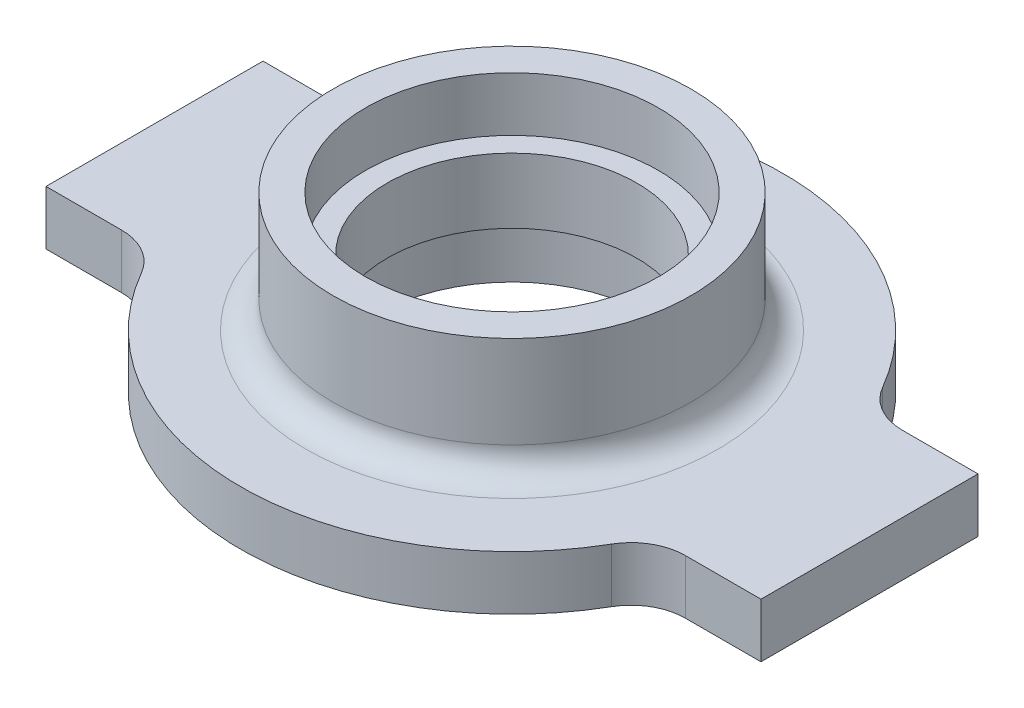
ISO-10303-21;
HEADER;
FILE_DESCRIPTION(('STEP AP214'),'2;1');
FILE_NAME('part.step','',(''),(''),'','','');
FILE_SCHEMA(('AUTOMOTIVE_DESIGN { 1 0 10303 214 1 1 1 1 }'));
ENDSEC;
DATA;
#1=APPLICATION_CONTEXT('core data for automotive mechanical design processes');
#2=APPLICATION_PROTOCOL_DEFINITION('international standard','automotive_design',2000,#1);
#3=PRODUCT_CONTEXT('',#1,'mechanical');
#4=PRODUCT('Part','Part','',(#3));
#5=PRODUCT_RELATED_PRODUCT_CATEGORY('part','',(#4));
#6=PRODUCT_DEFINITION_FORMATION('','',#4);
#7=PRODUCT_DEFINITION_CONTEXT('part definition',#1,'design');
#8=PRODUCT_DEFINITION('design','',#6,#7);
#9=PRODUCT_DEFINITION_SHAPE('','',#8);
#10=(LENGTH_UNIT() NAMED_UNIT(*) SI_UNIT(.MILLI.,.METRE.));
#11=(NAMED_UNIT(*) PLANE_ANGLE_UNIT() SI_UNIT($,.RADIAN.));
#12=(NAMED_UNIT(*) SI_UNIT($,.STERADIAN.) SOLID_ANGLE_UNIT());
#13=UNCERTAINTY_MEASURE_WITH_UNIT(LENGTH_MEASURE(1.E-05),#10,'distance_accuracy_value','');
#14=(GEOMETRIC_REPRESENTATION_CONTEXT(3) GLOBAL_UNCERTAINTY_ASSIGNED_CONTEXT((#13)) GLOBAL_UNIT_ASSIGNED_CONTEXT((#10,
#11,#12)) REPRESENTATION_CONTEXT('',''));
#15=CARTESIAN_POINT('',(0.,0.,0.));
#16=DIRECTION('',(0.,0.,1.));
#17=DIRECTION('',(1.,0.,0.));
#18=AXIS2_PLACEMENT_3D('',#15,#16,#17);
#19=CARTESIAN_POINT('',(0.,11.,0.));
#20=DIRECTION('',(0.,1.,0.));
#21=DIRECTION('',(0.,0.,1.));
#22=AXIS2_PLACEMENT_3D('',#19,#20,#21);
#23=PLANE('',#22);
#24=CARTESIAN_POINT('',(0.,11.,0.));
#25=DIRECTION('',(0.,1.,0.));
#26=DIRECTION('',(0.,0.,1.));
#27=AXIS2_PLACEMENT_3D('',#24,#25,#26);
#28=CIRCLE('',#27,11.5);
#29=CARTESIAN_POINT('',(0.,11.,11.5));
#30=VERTEX_POINT('',#29);
#31=EDGE_CURVE('E508',#30,#30,#28,.T.);
#32=ORIENTED_EDGE('',*,*,#31,.F.);
#33=EDGE_LOOP('',(#32));
#34=FACE_BOUND('',#33,.T.);
#35=CARTESIAN_POINT('',(0.,11.,0.));
#36=DIRECTION('',(0.,1.,0.));
#37=DIRECTION('',(0.,0.,1.));
#38=AXIS2_PLACEMENT_3D('',#35,#36,#37);
#39=CIRCLE('',#38,13.5);
#40=CARTESIAN_POINT('',(0.,11.,13.5));
#41=VERTEX_POINT('',#40);
#42=EDGE_CURVE('E533',#41,#41,#39,.T.);
#43=ORIENTED_EDGE('',*,*,#42,.T.);
#44=EDGE_LOOP('',(#43));
#45=FACE_BOUND('',#44,.T.);
#46=ADVANCED_FACE('F45',(#34,#45),#23,.T.);
#47=CARTESIAN_POINT('',(0.,5.,0.));
#48=DIRECTION('',(0.,1.,0.));
#49=DIRECTION('',(0.,0.,1.));
#50=AXIS2_PLACEMENT_3D('',#47,#48,#49);
#51=PLANE('',#50);
#52=CARTESIAN_POINT('',(0.,5.,0.));
#53=DIRECTION('',(0.,1.,0.));
#54=DIRECTION('',(0.,0.,1.));
#55=AXIS2_PLACEMENT_3D('',#52,#53,#54);
#56=CIRCLE('',#55,19.);
#57=CARTESIAN_POINT('',(0.,5.,19.));
#58=VERTEX_POINT('',#57);
#59=EDGE_CURVE('E168',#58,#58,#56,.F.);
#60=ORIENTED_EDGE('',*,*,#59,.T.);
#61=EDGE_LOOP('',(#60));
#62=FACE_BOUND('',#61,.T.);
#63=DIRECTION('',(0.,0.,1.));
#64=VECTOR('',#63,1.);
#65=CARTESIAN_POINT('',(-32.945,5.,10.));
#66=LINE('',#65,#64);
#67=CARTESIAN_POINT('',(-32.945,5.,-10.));
#68=VERTEX_POINT('',#67);
#69=CARTESIAN_POINT('',(-32.945,5.,10.));
#70=VERTEX_POINT('',#69);
#71=EDGE_CURVE('E146',#68,#70,#66,.T.);
#72=ORIENTED_EDGE('',*,*,#71,.T.);
#73=DIRECTION('',(1.,0.,0.));
#74=VECTOR('',#73,1.);
#75=CARTESIAN_POINT('',(-22.9128784747792,5.,10.));
#76=LINE('',#75,#74);
#77=CARTESIAN_POINT('',(-25.9807621135332,5.,10.));
#78=VERTEX_POINT('',#77);
#79=EDGE_CURVE('E134',#70,#78,#76,.T.);
#80=ORIENTED_EDGE('',*,*,#79,.T.);
#81=CARTESIAN_POINT('',(-25.9807621135332,5.,15.));
#82=DIRECTION('',(0.,1.,0.));
#83=DIRECTION('',(0.,0.,1.));
#84=AXIS2_PLACEMENT_3D('',#81,#82,#83);
#85=CIRCLE('',#84,5.);
#86=CARTESIAN_POINT('',(-21.650635094611,5.,12.5));
#87=VERTEX_POINT('',#86);
#88=EDGE_CURVE('E219',#78,#87,#85,.F.);
#89=ORIENTED_EDGE('',*,*,#88,.T.);
#90=CARTESIAN_POINT('',(0.,5.,0.));
#91=DIRECTION('',(0.,1.,0.));
#92=DIRECTION('',(0.,0.,1.));
#93=AXIS2_PLACEMENT_3D('',#90,#91,#92);
#94=CIRCLE('',#93,25.);
#95=CARTESIAN_POINT('',(21.650635094611,5.,12.5));
#96=VERTEX_POINT('',#95);
#97=EDGE_CURVE('E145',#87,#96,#94,.T.);
#98=ORIENTED_EDGE('',*,*,#97,.T.);
#99=CARTESIAN_POINT('',(25.9807621135332,5.,15.));
#100=DIRECTION('',(0.,1.,0.));
#101=DIRECTION('',(0.,0.,1.));
#102=AXIS2_PLACEMENT_3D('',#99,#100,#101);
#103=CIRCLE('',#102,5.);
#104=CARTESIAN_POINT('',(25.9807621135332,5.,10.));
#105=VERTEX_POINT('',#104);
#106=EDGE_CURVE('E11',#96,#105,#103,.F.);
#107=ORIENTED_EDGE('',*,*,#106,.T.);
#108=DIRECTION('',(1.,0.,0.));
#109=VECTOR('',#108,1.);
#110=CARTESIAN_POINT('',(32.945,5.,9.99999999999999));
#111=LINE('',#110,#109);
#112=CARTESIAN_POINT('',(32.945,5.,9.99999999999999));
#113=VERTEX_POINT('',#112);
#114=EDGE_CURVE('E241',#105,#113,#111,.T.);
#115=ORIENTED_EDGE('',*,*,#114,.T.);
#116=DIRECTION('',(0.,0.,-1.));
#117=VECTOR('',#116,1.);
#118=CARTESIAN_POINT('',(32.945,5.,9.99999999999999));
#119=LINE('',#118,#117);
#120=CARTESIAN_POINT('',(32.945,5.,-10.));
#121=VERTEX_POINT('',#120);
#122=EDGE_CURVE('E244',#113,#121,#119,.T.);
#123=ORIENTED_EDGE('',*,*,#122,.T.);
#124=DIRECTION('',(-1.,0.,0.));
#125=VECTOR('',#124,1.);
#126=CARTESIAN_POINT('',(32.945,5.,-10.));
#127=LINE('',#126,#125);
#128=CARTESIAN_POINT('',(25.9807621135332,5.,-10.));
#129=VERTEX_POINT('',#128);
#130=EDGE_CURVE('E248',#121,#129,#127,.T.);
#131=ORIENTED_EDGE('',*,*,#130,.T.);
#132=CARTESIAN_POINT('',(25.9807621135332,5.,-15.));
#133=DIRECTION('',(0.,1.,0.));
#134=DIRECTION('',(0.,0.,1.));
#135=AXIS2_PLACEMENT_3D('',#132,#133,#134);
#136=CIRCLE('',#135,5.);
#137=CARTESIAN_POINT('',(21.650635094611,5.,-12.5));
#138=VERTEX_POINT('',#137);
#139=EDGE_CURVE('E213',#129,#138,#136,.F.);
#140=ORIENTED_EDGE('',*,*,#139,.T.);
#141=CARTESIAN_POINT('',(0.,5.,0.));
#142=DIRECTION('',(0.,1.,0.));
#143=DIRECTION('',(0.,0.,1.));
#144=AXIS2_PLACEMENT_3D('',#141,#142,#143);
#145=CIRCLE('',#144,25.);
#146=CARTESIAN_POINT('',(-21.650635094611,5.,-12.5));
#147=VERTEX_POINT('',#146);
#148=EDGE_CURVE('E255',#138,#147,#145,.T.);
#149=ORIENTED_EDGE('',*,*,#148,.T.);
#150=CARTESIAN_POINT('',(-25.9807621135332,5.,-15.));
#151=DIRECTION('',(0.,1.,0.));
#152=DIRECTION('',(0.,0.,1.));
#153=AXIS2_PLACEMENT_3D('',#150,#151,#152);
#154=CIRCLE('',#153,5.);
#155=CARTESIAN_POINT('',(-25.9807621135332,5.,-10.));
#156=VERTEX_POINT('',#155);
#157=EDGE_CURVE('E207',#147,#156,#154,.F.);
#158=ORIENTED_EDGE('',*,*,#157,.T.);
#159=DIRECTION('',(-1.,0.,0.));
#160=VECTOR('',#159,1.);
#161=CARTESIAN_POINT('',(-22.9128784747792,5.,-9.99999999999999));
#162=LINE('',#161,#160);
#163=EDGE_CURVE('E151',#156,#68,#162,.T.);
#164=ORIENTED_EDGE('',*,*,#163,.T.);
#165=EDGE_LOOP('',(#72,#80,#89,#98,#107,#115,#123,#131,#140,#149,#158,#164));
#166=FACE_BOUND('',#165,.T.);
#167=ADVANCED_FACE('F149',(#62,#166),#51,.T.);
#168=CARTESIAN_POINT('',(0.,0.,0.));
#169=DIRECTION('',(0.,1.,0.));
#170=DIRECTION('',(0.,0.,1.));
#171=AXIS2_PLACEMENT_3D('',#168,#169,#170);
#172=PLANE('',#171);
#173=DIRECTION('',(0.,0.,1.));
#174=VECTOR('',#173,1.);
#175=CARTESIAN_POINT('',(-32.945,0.,10.));
#176=LINE('',#175,#174);
#177=CARTESIAN_POINT('',(-32.945,0.,-10.));
#178=VERTEX_POINT('',#177);
#179=CARTESIAN_POINT('',(-32.945,0.,10.));
#180=VERTEX_POINT('',#179);
#181=EDGE_CURVE('E160',#178,#180,#176,.T.);
#182=ORIENTED_EDGE('',*,*,#181,.F.);
#183=DIRECTION('',(-1.,0.,0.));
#184=VECTOR('',#183,1.);
#185=CARTESIAN_POINT('',(-22.9128784747792,0.,-9.99999999999999));
#186=LINE('',#185,#184);
#187=CARTESIAN_POINT('',(-25.9807621135332,0.,-10.));
#188=VERTEX_POINT('',#187);
#189=EDGE_CURVE('E156',#188,#178,#186,.T.);
#190=ORIENTED_EDGE('',*,*,#189,.F.);
#191=CARTESIAN_POINT('',(-25.9807621135332,0.,-15.));
#192=DIRECTION('',(0.,1.,0.));
#193=DIRECTION('',(0.,0.,1.));
#194=AXIS2_PLACEMENT_3D('',#191,#192,#193);
#195=CIRCLE('',#194,5.);
#196=CARTESIAN_POINT('',(-21.650635094611,0.,-12.5));
#197=VERTEX_POINT('',#196);
#198=EDGE_CURVE('E204',#188,#197,#195,.T.);
#199=ORIENTED_EDGE('',*,*,#198,.T.);
#200=CARTESIAN_POINT('',(0.,0.,0.));
#201=DIRECTION('',(0.,1.,0.));
#202=DIRECTION('',(0.,0.,1.));
#203=AXIS2_PLACEMENT_3D('',#200,#201,#202);
#204=CIRCLE('',#203,25.);
#205=CARTESIAN_POINT('',(21.650635094611,0.,-12.5));
#206=VERTEX_POINT('',#205);
#207=EDGE_CURVE('E276',#206,#197,#204,.T.);
#208=ORIENTED_EDGE('',*,*,#207,.F.);
#209=CARTESIAN_POINT('',(25.9807621135332,0.,-15.));
#210=DIRECTION('',(0.,1.,0.));
#211=DIRECTION('',(0.,0.,1.));
#212=AXIS2_PLACEMENT_3D('',#209,#210,#211);
#213=CIRCLE('',#212,5.);
#214=CARTESIAN_POINT('',(25.9807621135332,0.,-10.));
#215=VERTEX_POINT('',#214);
#216=EDGE_CURVE('E210',#206,#215,#213,.T.);
#217=ORIENTED_EDGE('',*,*,#216,.T.);
#218=DIRECTION('',(-1.,0.,0.));
#219=VECTOR('',#218,1.);
#220=CARTESIAN_POINT('',(32.945,0.,-10.));
#221=LINE('',#220,#219);
#222=CARTESIAN_POINT('',(32.945,0.,-10.));
#223=VERTEX_POINT('',#222);
#224=EDGE_CURVE('E272',#223,#215,#221,.T.);
#225=ORIENTED_EDGE('',*,*,#224,.F.);
#226=DIRECTION('',(0.,0.,-1.));
#227=VECTOR('',#226,1.);
#228=CARTESIAN_POINT('',(32.945,0.,9.99999999999999));
#229=LINE('',#228,#227);
#230=CARTESIAN_POINT('',(32.945,0.,9.99999999999999));
#231=VERTEX_POINT('',#230);
#232=EDGE_CURVE('E269',#231,#223,#229,.T.);
#233=ORIENTED_EDGE('',*,*,#232,.F.);
#234=DIRECTION('',(1.,0.,0.));
#235=VECTOR('',#234,1.);
#236=CARTESIAN_POINT('',(32.945,0.,9.99999999999999));
#237=LINE('',#236,#235);
#238=CARTESIAN_POINT('',(25.9807621135332,0.,10.));
#239=VERTEX_POINT('',#238);
#240=EDGE_CURVE('E230',#239,#231,#237,.T.);
#241=ORIENTED_EDGE('',*,*,#240,.F.);
#242=CARTESIAN_POINT('',(25.9807621135332,0.,15.));
#243=DIRECTION('',(0.,1.,0.));
#244=DIRECTION('',(0.,0.,1.));
#245=AXIS2_PLACEMENT_3D('',#242,#243,#244);
#246=CIRCLE('',#245,5.);
#247=CARTESIAN_POINT('',(21.650635094611,0.,12.5));
#248=VERTEX_POINT('',#247);
#249=EDGE_CURVE('E54',#239,#248,#246,.T.);
#250=ORIENTED_EDGE('',*,*,#249,.T.);
#251=CARTESIAN_POINT('',(0.,0.,0.));
#252=DIRECTION('',(0.,1.,0.));
#253=DIRECTION('',(0.,0.,1.));
#254=AXIS2_PLACEMENT_3D('',#251,#252,#253);
#255=CIRCLE('',#254,25.);
#256=CARTESIAN_POINT('',(-21.650635094611,0.,12.5));
#257=VERTEX_POINT('',#256);
#258=EDGE_CURVE('E228',#257,#248,#255,.T.);
#259=ORIENTED_EDGE('',*,*,#258,.F.);
#260=CARTESIAN_POINT('',(-25.9807621135332,0.,15.));
#261=DIRECTION('',(0.,1.,0.));
#262=DIRECTION('',(0.,0.,1.));
#263=AXIS2_PLACEMENT_3D('',#260,#261,#262);
#264=CIRCLE('',#263,5.);
#265=CARTESIAN_POINT('',(-25.9807621135332,0.,10.));
#266=VERTEX_POINT('',#265);
#267=EDGE_CURVE('E216',#257,#266,#264,.T.);
#268=ORIENTED_EDGE('',*,*,#267,.T.);
#269=DIRECTION('',(1.,0.,0.));
#270=VECTOR('',#269,1.);
#271=CARTESIAN_POINT('',(-22.9128784747792,0.,10.));
#272=LINE('',#271,#270);
#273=EDGE_CURVE('E236',#180,#266,#272,.T.);
#274=ORIENTED_EDGE('',*,*,#273,.F.);
#275=EDGE_LOOP('',(#182,#190,#199,#208,#217,#225,#233,#241,#250,#259,#268,#274));
#276=FACE_BOUND('',#275,.T.);
#277=CARTESIAN_POINT('',(0.,0.,0.));
#278=DIRECTION('',(0.,1.,0.));
#279=DIRECTION('',(0.,0.,1.));
#280=AXIS2_PLACEMENT_3D('',#277,#278,#279);
#281=CIRCLE('',#280,12.5);
#282=CARTESIAN_POINT('',(0.,0.,12.5));
#283=VERTEX_POINT('',#282);
#284=EDGE_CURVE('E264',#283,#283,#281,.T.);
#285=ORIENTED_EDGE('',*,*,#284,.T.);
#286=EDGE_LOOP('',(#285));
#287=FACE_BOUND('',#286,.T.);
#288=ADVANCED_FACE('F226',(#276,#287),#172,.F.);
#289=CARTESIAN_POINT('',(-32.945,5.,10.));
#290=DIRECTION('',(1.,0.,0.));
#291=DIRECTION('',(0.,0.,-1.));
#292=AXIS2_PLACEMENT_3D('',#289,#290,#291);
#293=PLANE('',#292);
#294=ORIENTED_EDGE('',*,*,#181,.T.);
#295=DIRECTION('',(0.,-1.,0.));
#296=VECTOR('',#295,1.);
#297=CARTESIAN_POINT('',(-32.945,5.,10.));
#298=LINE('',#297,#296);
#299=EDGE_CURVE('E139',#70,#180,#298,.T.);
#300=ORIENTED_EDGE('',*,*,#299,.F.);
#301=ORIENTED_EDGE('',*,*,#71,.F.);
#302=DIRECTION('',(0.,-1.,0.));
#303=VECTOR('',#302,1.);
#304=CARTESIAN_POINT('',(-32.945,5.,-10.));
#305=LINE('',#304,#303);
#306=EDGE_CURVE('E261',#68,#178,#305,.T.);
#307=ORIENTED_EDGE('',*,*,#306,.T.);
#308=EDGE_LOOP('',(#294,#300,#301,#307));
#309=FACE_BOUND('',#308,.T.);
#310=ADVANCED_FACE('F158',(#309),#293,.F.);
#311=CARTESIAN_POINT('',(-22.9128784747792,5.,10.));
#312=DIRECTION('',(0.,0.,-1.));
#313=DIRECTION('',(-1.,0.,0.));
#314=AXIS2_PLACEMENT_3D('',#311,#312,#313);
#315=PLANE('',#314);
#316=ORIENTED_EDGE('',*,*,#273,.T.);
#317=DIRECTION('',(0.,1.,0.));
#318=VECTOR('',#317,1.);
#319=CARTESIAN_POINT('',(-25.9807621135332,5.,10.));
#320=LINE('',#319,#318);
#321=EDGE_CURVE('E142',#266,#78,#320,.T.);
#322=ORIENTED_EDGE('',*,*,#321,.T.);
#323=ORIENTED_EDGE('',*,*,#79,.F.);
#324=ORIENTED_EDGE('',*,*,#299,.T.);
#325=EDGE_LOOP('',(#316,#322,#323,#324));
#326=FACE_BOUND('',#325,.T.);
#327=ADVANCED_FACE('F137',(#326),#315,.F.);
#328=CARTESIAN_POINT('',(0.,5.,0.));
#329=DIRECTION('',(0.,-1.,0.));
#330=DIRECTION('',(0.,0.,-1.));
#331=AXIS2_PLACEMENT_3D('',#328,#329,#330);
#332=CYLINDRICAL_SURFACE('',#331,25.);
#333=ORIENTED_EDGE('',*,*,#97,.F.);
#334=DIRECTION('',(0.,-1.,0.));
#335=VECTOR('',#334,1.);
#336=CARTESIAN_POINT('',(-21.650635094611,5.,12.5));
#337=LINE('',#336,#335);
#338=EDGE_CURVE('E195',#87,#257,#337,.T.);
#339=ORIENTED_EDGE('',*,*,#338,.T.);
#340=ORIENTED_EDGE('',*,*,#258,.T.);
#341=DIRECTION('',(0.,-1.,0.));
#342=VECTOR('',#341,1.);
#343=CARTESIAN_POINT('',(21.650635094611,5.,12.5));
#344=LINE('',#343,#342);
#345=EDGE_CURVE('E192',#248,#96,#344,.F.);
#346=ORIENTED_EDGE('',*,*,#345,.T.);
#347=EDGE_LOOP('',(#333,#339,#340,#346));
#348=FACE_BOUND('',#347,.T.);
#349=ADVANCED_FACE('F233',(#348),#332,.T.);
#350=CARTESIAN_POINT('',(32.945,5.,9.99999999999999));
#351=DIRECTION('',(0.,0.,-1.));
#352=DIRECTION('',(-1.,0.,0.));
#353=AXIS2_PLACEMENT_3D('',#350,#351,#352);
#354=PLANE('',#353);
#355=ORIENTED_EDGE('',*,*,#114,.F.);
#356=DIRECTION('',(0.,1.,0.));
#357=VECTOR('',#356,1.);
#358=CARTESIAN_POINT('',(25.9807621135332,0.,10.));
#359=LINE('',#358,#357);
#360=EDGE_CURVE('E201',#105,#239,#359,.F.);
#361=ORIENTED_EDGE('',*,*,#360,.T.);
#362=ORIENTED_EDGE('',*,*,#240,.T.);
#363=DIRECTION('',(0.,-1.,0.));
#364=VECTOR('',#363,1.);
#365=CARTESIAN_POINT('',(32.945,5.,9.99999999999999));
#366=LINE('',#365,#364);
#367=EDGE_CURVE('E163',#113,#231,#366,.T.);
#368=ORIENTED_EDGE('',*,*,#367,.F.);
#369=EDGE_LOOP('',(#355,#361,#362,#368));
#370=FACE_BOUND('',#369,.T.);
#371=ADVANCED_FACE('F239',(#370),#354,.F.);
#372=CARTESIAN_POINT('',(32.945,5.,9.99999999999999));
#373=DIRECTION('',(-1.,0.,0.));
#374=DIRECTION('',(0.,0.,1.));
#375=AXIS2_PLACEMENT_3D('',#372,#373,#374);
#376=PLANE('',#375);
#377=ORIENTED_EDGE('',*,*,#232,.T.);
#378=DIRECTION('',(0.,-1.,0.));
#379=VECTOR('',#378,1.);
#380=CARTESIAN_POINT('',(32.945,5.,-10.));
#381=LINE('',#380,#379);
#382=EDGE_CURVE('E171',#121,#223,#381,.T.);
#383=ORIENTED_EDGE('',*,*,#382,.F.);
#384=ORIENTED_EDGE('',*,*,#122,.F.);
#385=ORIENTED_EDGE('',*,*,#367,.T.);
#386=EDGE_LOOP('',(#377,#383,#384,#385));
#387=FACE_BOUND('',#386,.T.);
#388=ADVANCED_FACE('F352',(#387),#376,.F.);
#389=CARTESIAN_POINT('',(32.945,5.,-10.));
#390=DIRECTION('',(0.,0.,1.));
#391=DIRECTION('',(1.,0.,0.));
#392=AXIS2_PLACEMENT_3D('',#389,#390,#391);
#393=PLANE('',#392);
#394=ORIENTED_EDGE('',*,*,#224,.T.);
#395=DIRECTION('',(0.,1.,0.));
#396=VECTOR('',#395,1.);
#397=CARTESIAN_POINT('',(25.9807621135332,5.,-10.));
#398=LINE('',#397,#396);
#399=EDGE_CURVE('E189',#215,#129,#398,.T.);
#400=ORIENTED_EDGE('',*,*,#399,.T.);
#401=ORIENTED_EDGE('',*,*,#130,.F.);
#402=ORIENTED_EDGE('',*,*,#382,.T.);
#403=EDGE_LOOP('',(#394,#400,#401,#402));
#404=FACE_BOUND('',#403,.T.);
#405=ADVANCED_FACE('F289',(#404),#393,.F.);
#406=CARTESIAN_POINT('',(0.,5.,0.));
#407=DIRECTION('',(0.,-1.,0.));
#408=DIRECTION('',(0.,0.,-1.));
#409=AXIS2_PLACEMENT_3D('',#406,#407,#408);
#410=CYLINDRICAL_SURFACE('',#409,25.);
#411=ORIENTED_EDGE('',*,*,#207,.T.);
#412=DIRECTION('',(0.,-1.,0.));
#413=VECTOR('',#412,1.);
#414=CARTESIAN_POINT('',(-21.650635094611,5.,-12.5));
#415=LINE('',#414,#413);
#416=EDGE_CURVE('E186',#197,#147,#415,.F.);
#417=ORIENTED_EDGE('',*,*,#416,.T.);
#418=ORIENTED_EDGE('',*,*,#148,.F.);
#419=DIRECTION('',(0.,-1.,0.));
#420=VECTOR('',#419,1.);
#421=CARTESIAN_POINT('',(21.650635094611,5.,-12.5));
#422=LINE('',#421,#420);
#423=EDGE_CURVE('E182',#138,#206,#422,.T.);
#424=ORIENTED_EDGE('',*,*,#423,.T.);
#425=EDGE_LOOP('',(#411,#417,#418,#424));
#426=FACE_BOUND('',#425,.T.);
#427=ADVANCED_FACE('F299',(#426),#410,.T.);
#428=CARTESIAN_POINT('',(-22.9128784747792,5.,-9.99999999999999));
#429=DIRECTION('',(0.,0.,1.));
#430=DIRECTION('',(1.,0.,0.));
#431=AXIS2_PLACEMENT_3D('',#428,#429,#430);
#432=PLANE('',#431);
#433=ORIENTED_EDGE('',*,*,#163,.F.);
#434=DIRECTION('',(0.,1.,0.));
#435=VECTOR('',#434,1.);
#436=CARTESIAN_POINT('',(-25.9807621135332,0.,-10.));
#437=LINE('',#436,#435);
#438=EDGE_CURVE('E178',#156,#188,#437,.F.);
#439=ORIENTED_EDGE('',*,*,#438,.T.);
#440=ORIENTED_EDGE('',*,*,#189,.T.);
#441=ORIENTED_EDGE('',*,*,#306,.F.);
#442=EDGE_LOOP('',(#433,#439,#440,#441));
#443=FACE_BOUND('',#442,.T.);
#444=ADVANCED_FACE('F307',(#443),#432,.F.);
#445=CARTESIAN_POINT('',(0.,5.,0.));
#446=DIRECTION('',(0.,-1.,0.));
#447=DIRECTION('',(0.,0.,-1.));
#448=AXIS2_PLACEMENT_3D('',#445,#446,#447);
#449=CYLINDRICAL_SURFACE('',#448,12.5);
#450=CARTESIAN_POINT('',(0.,5.,0.));
#451=DIRECTION('',(0.,1.,0.));
#452=DIRECTION('',(0.,0.,1.));
#453=AXIS2_PLACEMENT_3D('',#450,#451,#452);
#454=CIRCLE('',#453,12.5);
#455=CARTESIAN_POINT('',(0.,5.,12.5));
#456=VERTEX_POINT('',#455);
#457=EDGE_CURVE('E517',#456,#456,#454,.T.);
#458=ORIENTED_EDGE('',*,*,#457,.T.);
#459=EDGE_LOOP('',(#458));
#460=FACE_BOUND('',#459,.T.);
#461=ORIENTED_EDGE('',*,*,#284,.F.);
#462=EDGE_LOOP('',(#461));
#463=FACE_BOUND('',#462,.T.);
#464=ADVANCED_FACE('F336',(#460,#463),#449,.F.);
#465=CARTESIAN_POINT('',(0.,5.,0.));
#466=DIRECTION('',(0.,1.,0.));
#467=DIRECTION('',(0.,0.,1.));
#468=AXIS2_PLACEMENT_3D('',#465,#466,#467);
#469=PLANE('',#468);
#470=CARTESIAN_POINT('',(0.,5.,0.));
#471=DIRECTION('',(0.,1.,0.));
#472=DIRECTION('',(0.,0.,1.));
#473=AXIS2_PLACEMENT_3D('',#470,#471,#472);
#474=CIRCLE('',#473,11.5);
#475=CARTESIAN_POINT('',(0.,5.,11.5));
#476=VERTEX_POINT('',#475);
#477=EDGE_CURVE('E511',#476,#476,#474,.T.);
#478=ORIENTED_EDGE('',*,*,#477,.T.);
#479=EDGE_LOOP('',(#478));
#480=FACE_BOUND('',#479,.T.);
#481=ORIENTED_EDGE('',*,*,#457,.F.);
#482=EDGE_LOOP('',(#481));
#483=FACE_BOUND('',#482,.T.);
#484=ADVANCED_FACE('F332',(#480,#483),#469,.F.);
#485=CARTESIAN_POINT('',(0.,11.,0.));
#486=DIRECTION('',(0.,-1.,0.));
#487=DIRECTION('',(0.,0.,-1.));
#488=AXIS2_PLACEMENT_3D('',#485,#486,#487);
#489=CYLINDRICAL_SURFACE('',#488,16.5);
#490=CARTESIAN_POINT('',(0.,7.5,0.));
#491=DIRECTION('',(0.,1.,0.));
#492=DIRECTION('',(0.,0.,1.));
#493=AXIS2_PLACEMENT_3D('',#490,#491,#492);
#494=CIRCLE('',#493,16.5);
#495=CARTESIAN_POINT('',(0.,7.5,16.5));
#496=VERTEX_POINT('',#495);
#497=EDGE_CURVE('E162',#496,#496,#494,.T.);
#498=ORIENTED_EDGE('',*,*,#497,.T.);
#499=EDGE_LOOP('',(#498));
#500=FACE_BOUND('',#499,.T.);
#501=CARTESIAN_POINT('',(0.,16.,0.));
#502=DIRECTION('',(0.,1.,0.));
#503=DIRECTION('',(0.,0.,1.));
#504=AXIS2_PLACEMENT_3D('',#501,#502,#503);
#505=CIRCLE('',#504,16.5);
#506=CARTESIAN_POINT('',(0.,16.,16.5));
#507=VERTEX_POINT('',#506);
#508=EDGE_CURVE('E513',#507,#507,#505,.T.);
#509=ORIENTED_EDGE('',*,*,#508,.F.);
#510=EDGE_LOOP('',(#509));
#511=FACE_BOUND('',#510,.T.);
#512=ADVANCED_FACE('F335',(#500,#511),#489,.T.);
#513=CARTESIAN_POINT('',(0.,11.,0.));
#514=DIRECTION('',(0.,-1.,0.));
#515=DIRECTION('',(0.,0.,-1.));
#516=AXIS2_PLACEMENT_3D('',#513,#514,#515);
#517=CYLINDRICAL_SURFACE('',#516,11.5);
#518=ORIENTED_EDGE('',*,*,#31,.T.);
#519=EDGE_LOOP('',(#518));
#520=FACE_BOUND('',#519,.T.);
#521=ORIENTED_EDGE('',*,*,#477,.F.);
#522=EDGE_LOOP('',(#521));
#523=FACE_BOUND('',#522,.T.);
#524=ADVANCED_FACE('F330',(#520,#523),#517,.F.);
#525=CARTESIAN_POINT('',(0.,16.,0.));
#526=DIRECTION('',(0.,1.,0.));
#527=DIRECTION('',(0.,0.,1.));
#528=AXIS2_PLACEMENT_3D('',#525,#526,#527);
#529=PLANE('',#528);
#530=ORIENTED_EDGE('',*,*,#508,.T.);
#531=EDGE_LOOP('',(#530));
#532=FACE_BOUND('',#531,.T.);
#533=CARTESIAN_POINT('',(0.,16.,0.));
#534=DIRECTION('',(0.,1.,0.));
#535=DIRECTION('',(0.,0.,1.));
#536=AXIS2_PLACEMENT_3D('',#533,#534,#535);
#537=CIRCLE('',#536,13.5);
#538=CARTESIAN_POINT('',(0.,16.,13.5));
#539=VERTEX_POINT('',#538);
#540=EDGE_CURVE('E520',#539,#539,#537,.T.);
#541=ORIENTED_EDGE('',*,*,#540,.F.);
#542=EDGE_LOOP('',(#541));
#543=FACE_BOUND('',#542,.T.);
#544=ADVANCED_FACE('F403',(#532,#543),#529,.T.);
#545=CARTESIAN_POINT('',(0.,16.,0.));
#546=DIRECTION('',(0.,-1.,0.));
#547=DIRECTION('',(0.,0.,-1.));
#548=AXIS2_PLACEMENT_3D('',#545,#546,#547);
#549=CYLINDRICAL_SURFACE('',#548,13.5);
#550=ORIENTED_EDGE('',*,*,#540,.T.);
#551=EDGE_LOOP('',(#550));
#552=FACE_BOUND('',#551,.T.);
#553=ORIENTED_EDGE('',*,*,#42,.F.);
#554=EDGE_LOOP('',(#553));
#555=FACE_BOUND('',#554,.T.);
#556=ADVANCED_FACE('F366',(#552,#555),#549,.F.);
#557=CARTESIAN_POINT('',(0.,7.5,0.));
#558=DIRECTION('',(0.,1.,0.));
#559=DIRECTION('',(0.,0.,1.));
#560=AXIS2_PLACEMENT_3D('',#557,#558,#559);
#561=TOROIDAL_SURFACE('',#560,19.,2.5);
#562=ORIENTED_EDGE('',*,*,#59,.F.);
#563=EDGE_LOOP('',(#562));
#564=FACE_BOUND('',#563,.T.);
#565=ORIENTED_EDGE('',*,*,#497,.F.);
#566=EDGE_LOOP('',(#565));
#567=FACE_BOUND('',#566,.T.);
#568=ADVANCED_FACE('F363',(#564,#567),#561,.F.);
#569=CARTESIAN_POINT('',(-25.9807621135332,5.,-15.));
#570=DIRECTION('',(0.,-1.,0.));
#571=DIRECTION('',(0.,0.,-1.));
#572=AXIS2_PLACEMENT_3D('',#569,#570,#571);
#573=CYLINDRICAL_SURFACE('',#572,5.);
#574=ORIENTED_EDGE('',*,*,#157,.F.);
#575=ORIENTED_EDGE('',*,*,#416,.F.);
#576=ORIENTED_EDGE('',*,*,#198,.F.);
#577=ORIENTED_EDGE('',*,*,#438,.F.);
#578=EDGE_LOOP('',(#574,#575,#576,#577));
#579=FACE_BOUND('',#578,.T.);
#580=ADVANCED_FACE('F304',(#579),#573,.F.);
#581=CARTESIAN_POINT('',(25.9807621135332,5.,-15.));
#582=DIRECTION('',(0.,-1.,0.));
#583=DIRECTION('',(0.,0.,-1.));
#584=AXIS2_PLACEMENT_3D('',#581,#582,#583);
#585=CYLINDRICAL_SURFACE('',#584,5.);
#586=ORIENTED_EDGE('',*,*,#139,.F.);
#587=ORIENTED_EDGE('',*,*,#399,.F.);
#588=ORIENTED_EDGE('',*,*,#216,.F.);
#589=ORIENTED_EDGE('',*,*,#423,.F.);
#590=EDGE_LOOP('',(#586,#587,#588,#589));
#591=FACE_BOUND('',#590,.T.);
#592=ADVANCED_FACE('F296',(#591),#585,.F.);
#593=CARTESIAN_POINT('',(-25.9807621135332,5.,15.));
#594=DIRECTION('',(0.,-1.,0.));
#595=DIRECTION('',(0.,0.,-1.));
#596=AXIS2_PLACEMENT_3D('',#593,#594,#595);
#597=CYLINDRICAL_SURFACE('',#596,5.);
#598=ORIENTED_EDGE('',*,*,#88,.F.);
#599=ORIENTED_EDGE('',*,*,#321,.F.);
#600=ORIENTED_EDGE('',*,*,#267,.F.);
#601=ORIENTED_EDGE('',*,*,#338,.F.);
#602=EDGE_LOOP('',(#598,#599,#600,#601));
#603=FACE_BOUND('',#602,.T.);
#604=ADVANCED_FACE('F309',(#603),#597,.F.);
#605=CARTESIAN_POINT('',(25.9807621135332,5.,15.));
#606=DIRECTION('',(0.,-1.,0.));
#607=DIRECTION('',(0.,0.,-1.));
#608=AXIS2_PLACEMENT_3D('',#605,#606,#607);
#609=CYLINDRICAL_SURFACE('',#608,5.);
#610=ORIENTED_EDGE('',*,*,#106,.F.);
#611=ORIENTED_EDGE('',*,*,#345,.F.);
#612=ORIENTED_EDGE('',*,*,#249,.F.);
#613=ORIENTED_EDGE('',*,*,#360,.F.);
#614=EDGE_LOOP('',(#610,#611,#612,#613));
#615=FACE_BOUND('',#614,.T.);
#616=ADVANCED_FACE('F47',(#615),#609,.F.);
#617=CLOSED_SHELL('',(#46,#167,#288,#310,#327,#349,#371,#388,#405,#427,#444,#464,#484,#512,#524,
#544,#556,#568,#580,#592,#604,#616));
#618=MANIFOLD_SOLID_BREP('B2',#617);
#619=ADVANCED_BREP_SHAPE_REPRESENTATION('',(#18,#618),#14);
#620=SHAPE_DEFINITION_REPRESENTATION(#9,#619);
ENDSEC;
END-ISO-10303-21;
